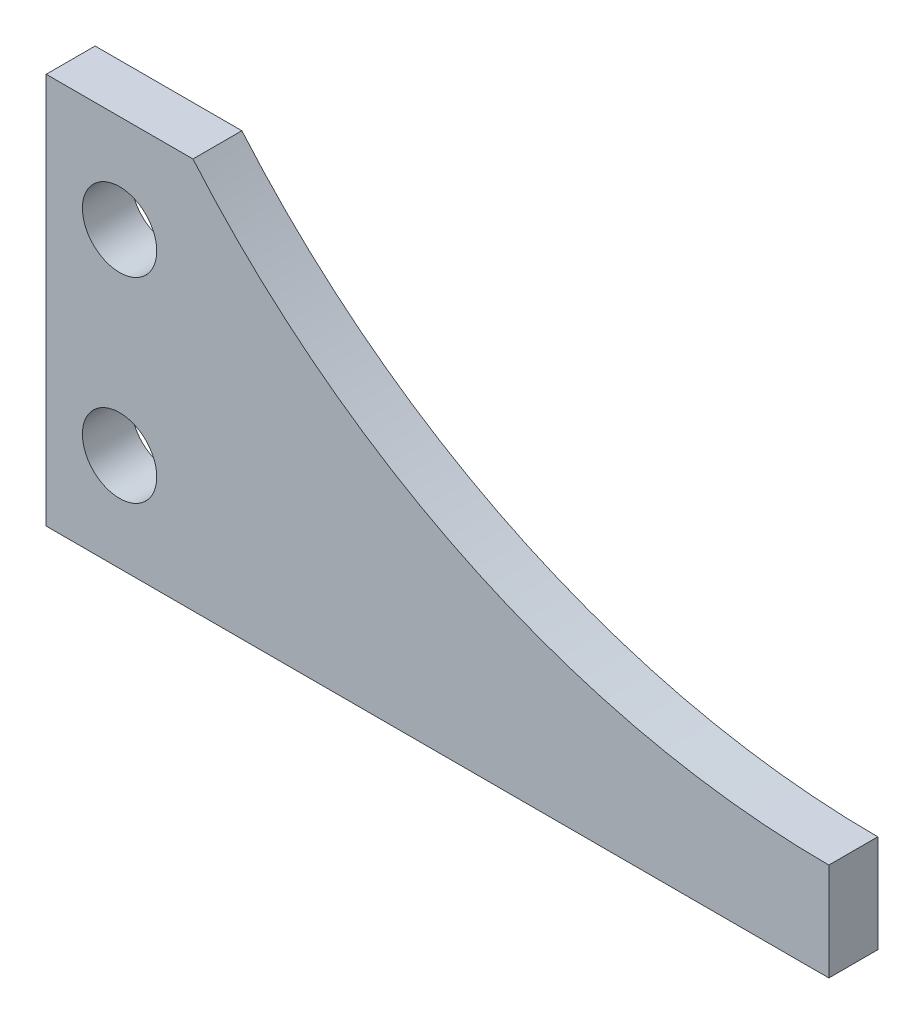
ISO-10303-21;
HEADER;
FILE_DESCRIPTION(('STEP AP214'),'2;1');
FILE_NAME('part.step','',(''),(''),'','','');
FILE_SCHEMA(('AUTOMOTIVE_DESIGN { 1 0 10303 214 1 1 1 1 }'));
ENDSEC;
DATA;
#1=APPLICATION_CONTEXT('core data for automotive mechanical design processes');
#2=APPLICATION_PROTOCOL_DEFINITION('international standard','automotive_design',2000,#1);
#3=PRODUCT_CONTEXT('',#1,'mechanical');
#4=PRODUCT('Part','Part','',(#3));
#5=PRODUCT_RELATED_PRODUCT_CATEGORY('part','',(#4));
#6=PRODUCT_DEFINITION_FORMATION('','',#4);
#7=PRODUCT_DEFINITION_CONTEXT('part definition',#1,'design');
#8=PRODUCT_DEFINITION('design','',#6,#7);
#9=PRODUCT_DEFINITION_SHAPE('','',#8);
#10=(LENGTH_UNIT() NAMED_UNIT(*) SI_UNIT(.MILLI.,.METRE.));
#11=(NAMED_UNIT(*) PLANE_ANGLE_UNIT() SI_UNIT($,.RADIAN.));
#12=(NAMED_UNIT(*) SI_UNIT($,.STERADIAN.) SOLID_ANGLE_UNIT());
#13=UNCERTAINTY_MEASURE_WITH_UNIT(LENGTH_MEASURE(1.E-05),#10,'distance_accuracy_value','');
#14=(GEOMETRIC_REPRESENTATION_CONTEXT(3) GLOBAL_UNCERTAINTY_ASSIGNED_CONTEXT((#13)) GLOBAL_UNIT_ASSIGNED_CONTEXT((#10,
#11,#12)) REPRESENTATION_CONTEXT('',''));
#15=CARTESIAN_POINT('',(0.,0.,0.));
#16=DIRECTION('',(0.,0.,1.));
#17=DIRECTION('',(1.,0.,0.));
#18=AXIS2_PLACEMENT_3D('',#15,#16,#17);
#19=CARTESIAN_POINT('',(50.8,60.5895833333333,3.175));
#20=DIRECTION('',(0.,0.,1.));
#21=DIRECTION('',(1.,0.,0.));
#22=AXIS2_PLACEMENT_3D('',#19,#20,#21);
#23=PLANE('',#22);
#24=CARTESIAN_POINT('',(4.7625,19.05,3.175));
#25=DIRECTION('',(0.,0.,1.));
#26=DIRECTION('',(1.,0.,0.));
#27=AXIS2_PLACEMENT_3D('',#24,#25,#26);
#28=CIRCLE('',#27,2.413);
#29=CARTESIAN_POINT('',(7.1755,19.05,3.175));
#30=VERTEX_POINT('',#29);
#31=EDGE_CURVE('E112',#30,#30,#28,.T.);
#32=ORIENTED_EDGE('',*,*,#31,.F.);
#33=EDGE_LOOP('',(#32));
#34=FACE_BOUND('',#33,.T.);
#35=DIRECTION('',(1.,0.,0.));
#36=VECTOR('',#35,1.);
#37=CARTESIAN_POINT('',(0.,0.,3.175));
#38=LINE('',#37,#36);
#39=CARTESIAN_POINT('',(0.,0.,3.175));
#40=VERTEX_POINT('',#39);
#41=CARTESIAN_POINT('',(50.8,0.,3.175));
#42=VERTEX_POINT('',#41);
#43=EDGE_CURVE('E117',#40,#42,#38,.T.);
#44=ORIENTED_EDGE('',*,*,#43,.T.);
#45=DIRECTION('',(0.,1.,0.));
#46=VECTOR('',#45,1.);
#47=CARTESIAN_POINT('',(50.8,0.,3.175));
#48=LINE('',#47,#46);
#49=CARTESIAN_POINT('',(50.8,6.35,3.175));
#50=VERTEX_POINT('',#49);
#51=EDGE_CURVE('E84',#42,#50,#48,.T.);
#52=ORIENTED_EDGE('',*,*,#51,.T.);
#53=CARTESIAN_POINT('',(50.8,60.5895833333333,3.175));
#54=DIRECTION('',(0.,0.,-1.));
#55=DIRECTION('',(1.,0.,0.));
#56=AXIS2_PLACEMENT_3D('',#53,#54,#55);
#57=CIRCLE('',#56,54.2395833333333);
#58=CARTESIAN_POINT('',(9.525,25.4,3.175));
#59=VERTEX_POINT('',#58);
#60=EDGE_CURVE('E88',#50,#59,#57,.T.);
#61=ORIENTED_EDGE('',*,*,#60,.T.);
#62=DIRECTION('',(-1.,0.,0.));
#63=VECTOR('',#62,1.);
#64=CARTESIAN_POINT('',(0.,25.4,3.175));
#65=LINE('',#64,#63);
#66=CARTESIAN_POINT('',(0.,25.4,3.175));
#67=VERTEX_POINT('',#66);
#68=EDGE_CURVE('E92',#59,#67,#65,.T.);
#69=ORIENTED_EDGE('',*,*,#68,.T.);
#70=DIRECTION('',(0.,-1.,0.));
#71=VECTOR('',#70,1.);
#72=CARTESIAN_POINT('',(0.,0.,3.175));
#73=LINE('',#72,#71);
#74=EDGE_CURVE('E50',#67,#40,#73,.T.);
#75=ORIENTED_EDGE('',*,*,#74,.T.);
#76=EDGE_LOOP('',(#44,#52,#61,#69,#75));
#77=FACE_BOUND('',#76,.T.);
#78=CARTESIAN_POINT('',(4.7625,6.35,3.175));
#79=DIRECTION('',(0.,0.,1.));
#80=DIRECTION('',(1.,0.,0.));
#81=AXIS2_PLACEMENT_3D('',#78,#79,#80);
#82=CIRCLE('',#81,2.413);
#83=CARTESIAN_POINT('',(7.1755,6.35,3.175));
#84=VERTEX_POINT('',#83);
#85=EDGE_CURVE('E154',#84,#84,#82,.T.);
#86=ORIENTED_EDGE('',*,*,#85,.F.);
#87=EDGE_LOOP('',(#86));
#88=FACE_BOUND('',#87,.T.);
#89=ADVANCED_FACE('F33',(#34,#77,#88),#23,.T.);
#90=CARTESIAN_POINT('',(50.8,60.5895833333333,0.));
#91=DIRECTION('',(0.,0.,1.));
#92=DIRECTION('',(1.,0.,0.));
#93=AXIS2_PLACEMENT_3D('',#90,#91,#92);
#94=PLANE('',#93);
#95=DIRECTION('',(1.,0.,0.));
#96=VECTOR('',#95,1.);
#97=CARTESIAN_POINT('',(0.,0.,0.));
#98=LINE('',#97,#96);
#99=CARTESIAN_POINT('',(0.,0.,0.));
#100=VERTEX_POINT('',#99);
#101=CARTESIAN_POINT('',(50.8,0.,0.));
#102=VERTEX_POINT('',#101);
#103=EDGE_CURVE('E108',#100,#102,#98,.T.);
#104=ORIENTED_EDGE('',*,*,#103,.F.);
#105=DIRECTION('',(0.,-1.,0.));
#106=VECTOR('',#105,1.);
#107=CARTESIAN_POINT('',(0.,0.,0.));
#108=LINE('',#107,#106);
#109=CARTESIAN_POINT('',(0.,25.4,0.));
#110=VERTEX_POINT('',#109);
#111=EDGE_CURVE('E76',#110,#100,#108,.T.);
#112=ORIENTED_EDGE('',*,*,#111,.F.);
#113=DIRECTION('',(-1.,0.,0.));
#114=VECTOR('',#113,1.);
#115=CARTESIAN_POINT('',(0.,25.4,0.));
#116=LINE('',#115,#114);
#117=CARTESIAN_POINT('',(9.525,25.4,0.));
#118=VERTEX_POINT('',#117);
#119=EDGE_CURVE('E70',#118,#110,#116,.T.);
#120=ORIENTED_EDGE('',*,*,#119,.F.);
#121=CARTESIAN_POINT('',(50.8,60.5895833333333,0.));
#122=DIRECTION('',(0.,0.,-1.));
#123=DIRECTION('',(1.,0.,0.));
#124=AXIS2_PLACEMENT_3D('',#121,#122,#123);
#125=CIRCLE('',#124,54.2395833333333);
#126=CARTESIAN_POINT('',(50.8,6.35,0.));
#127=VERTEX_POINT('',#126);
#128=EDGE_CURVE('E99',#127,#118,#125,.T.);
#129=ORIENTED_EDGE('',*,*,#128,.F.);
#130=DIRECTION('',(0.,1.,0.));
#131=VECTOR('',#130,1.);
#132=CARTESIAN_POINT('',(50.8,0.,0.));
#133=LINE('',#132,#131);
#134=EDGE_CURVE('E111',#102,#127,#133,.T.);
#135=ORIENTED_EDGE('',*,*,#134,.F.);
#136=EDGE_LOOP('',(#104,#112,#120,#129,#135));
#137=FACE_BOUND('',#136,.T.);
#138=CARTESIAN_POINT('',(4.7625,19.05,0.));
#139=DIRECTION('',(0.,0.,1.));
#140=DIRECTION('',(1.,0.,0.));
#141=AXIS2_PLACEMENT_3D('',#138,#139,#140);
#142=CIRCLE('',#141,2.413);
#143=CARTESIAN_POINT('',(7.1755,19.05,0.));
#144=VERTEX_POINT('',#143);
#145=EDGE_CURVE('E160',#144,#144,#142,.T.);
#146=ORIENTED_EDGE('',*,*,#145,.T.);
#147=EDGE_LOOP('',(#146));
#148=FACE_BOUND('',#147,.T.);
#149=CARTESIAN_POINT('',(4.7625,6.35,0.));
#150=DIRECTION('',(0.,0.,1.));
#151=DIRECTION('',(1.,0.,0.));
#152=AXIS2_PLACEMENT_3D('',#149,#150,#151);
#153=CIRCLE('',#152,2.413);
#154=CARTESIAN_POINT('',(7.1755,6.35,0.));
#155=VERTEX_POINT('',#154);
#156=EDGE_CURVE('E157',#155,#155,#153,.T.);
#157=ORIENTED_EDGE('',*,*,#156,.T.);
#158=EDGE_LOOP('',(#157));
#159=FACE_BOUND('',#158,.T.);
#160=ADVANCED_FACE('F121',(#137,#148,#159),#94,.F.);
#161=CARTESIAN_POINT('',(0.,0.,3.175));
#162=DIRECTION('',(0.,1.,0.));
#163=DIRECTION('',(0.,0.,1.));
#164=AXIS2_PLACEMENT_3D('',#161,#162,#163);
#165=PLANE('',#164);
#166=ORIENTED_EDGE('',*,*,#103,.T.);
#167=DIRECTION('',(0.,0.,-1.));
#168=VECTOR('',#167,1.);
#169=CARTESIAN_POINT('',(50.8,0.,3.175));
#170=LINE('',#169,#168);
#171=EDGE_CURVE('E11',#42,#102,#170,.T.);
#172=ORIENTED_EDGE('',*,*,#171,.F.);
#173=ORIENTED_EDGE('',*,*,#43,.F.);
#174=DIRECTION('',(0.,0.,-1.));
#175=VECTOR('',#174,1.);
#176=CARTESIAN_POINT('',(0.,0.,3.175));
#177=LINE('',#176,#175);
#178=EDGE_CURVE('E104',#40,#100,#177,.T.);
#179=ORIENTED_EDGE('',*,*,#178,.T.);
#180=EDGE_LOOP('',(#166,#172,#173,#179));
#181=FACE_BOUND('',#180,.T.);
#182=ADVANCED_FACE('F35',(#181),#165,.F.);
#183=CARTESIAN_POINT('',(50.8,0.,3.175));
#184=DIRECTION('',(-1.,0.,0.));
#185=DIRECTION('',(0.,-1.,0.));
#186=AXIS2_PLACEMENT_3D('',#183,#184,#185);
#187=PLANE('',#186);
#188=ORIENTED_EDGE('',*,*,#134,.T.);
#189=DIRECTION('',(0.,0.,-1.));
#190=VECTOR('',#189,1.);
#191=CARTESIAN_POINT('',(50.8,6.35,3.175));
#192=LINE('',#191,#190);
#193=EDGE_CURVE('E42',#50,#127,#192,.T.);
#194=ORIENTED_EDGE('',*,*,#193,.F.);
#195=ORIENTED_EDGE('',*,*,#51,.F.);
#196=ORIENTED_EDGE('',*,*,#171,.T.);
#197=EDGE_LOOP('',(#188,#194,#195,#196));
#198=FACE_BOUND('',#197,.T.);
#199=ADVANCED_FACE('F192',(#198),#187,.F.);
#200=CARTESIAN_POINT('',(50.8,60.5895833333333,3.175));
#201=DIRECTION('',(0.,0.,-1.));
#202=DIRECTION('',(-1.,0.,0.));
#203=AXIS2_PLACEMENT_3D('',#200,#201,#202);
#204=CYLINDRICAL_SURFACE('',#203,54.2395833333333);
#205=ORIENTED_EDGE('',*,*,#128,.T.);
#206=DIRECTION('',(0.,0.,-1.));
#207=VECTOR('',#206,1.);
#208=CARTESIAN_POINT('',(9.525,25.4,3.175));
#209=LINE('',#208,#207);
#210=EDGE_CURVE('E96',#59,#118,#209,.T.);
#211=ORIENTED_EDGE('',*,*,#210,.F.);
#212=ORIENTED_EDGE('',*,*,#60,.F.);
#213=ORIENTED_EDGE('',*,*,#193,.T.);
#214=EDGE_LOOP('',(#205,#211,#212,#213));
#215=FACE_BOUND('',#214,.T.);
#216=ADVANCED_FACE('F97',(#215),#204,.F.);
#217=CARTESIAN_POINT('',(0.,25.4,3.175));
#218=DIRECTION('',(0.,-1.,0.));
#219=DIRECTION('',(0.,0.,-1.));
#220=AXIS2_PLACEMENT_3D('',#217,#218,#219);
#221=PLANE('',#220);
#222=ORIENTED_EDGE('',*,*,#119,.T.);
#223=DIRECTION('',(0.,0.,-1.));
#224=VECTOR('',#223,1.);
#225=CARTESIAN_POINT('',(0.,25.4,3.175));
#226=LINE('',#225,#224);
#227=EDGE_CURVE('E100',#67,#110,#226,.T.);
#228=ORIENTED_EDGE('',*,*,#227,.F.);
#229=ORIENTED_EDGE('',*,*,#68,.F.);
#230=ORIENTED_EDGE('',*,*,#210,.T.);
#231=EDGE_LOOP('',(#222,#228,#229,#230));
#232=FACE_BOUND('',#231,.T.);
#233=ADVANCED_FACE('F102',(#232),#221,.F.);
#234=CARTESIAN_POINT('',(0.,0.,3.175));
#235=DIRECTION('',(1.,0.,0.));
#236=DIRECTION('',(0.,0.,-1.));
#237=AXIS2_PLACEMENT_3D('',#234,#235,#236);
#238=PLANE('',#237);
#239=ORIENTED_EDGE('',*,*,#111,.T.);
#240=ORIENTED_EDGE('',*,*,#178,.F.);
#241=ORIENTED_EDGE('',*,*,#74,.F.);
#242=ORIENTED_EDGE('',*,*,#227,.T.);
#243=EDGE_LOOP('',(#239,#240,#241,#242));
#244=FACE_BOUND('',#243,.T.);
#245=ADVANCED_FACE('F126',(#244),#238,.F.);
#246=CARTESIAN_POINT('',(4.7625,19.05,3.175));
#247=DIRECTION('',(0.,0.,-1.));
#248=DIRECTION('',(-1.,0.,0.));
#249=AXIS2_PLACEMENT_3D('',#246,#247,#248);
#250=CYLINDRICAL_SURFACE('',#249,2.413);
#251=ORIENTED_EDGE('',*,*,#31,.T.);
#252=EDGE_LOOP('',(#251));
#253=FACE_BOUND('',#252,.T.);
#254=ORIENTED_EDGE('',*,*,#145,.F.);
#255=EDGE_LOOP('',(#254));
#256=FACE_BOUND('',#255,.T.);
#257=ADVANCED_FACE('F128',(#253,#256),#250,.F.);
#258=CARTESIAN_POINT('',(4.7625,6.35,3.175));
#259=DIRECTION('',(0.,0.,-1.));
#260=DIRECTION('',(-1.,0.,0.));
#261=AXIS2_PLACEMENT_3D('',#258,#259,#260);
#262=CYLINDRICAL_SURFACE('',#261,2.413);
#263=ORIENTED_EDGE('',*,*,#85,.T.);
#264=EDGE_LOOP('',(#263));
#265=FACE_BOUND('',#264,.T.);
#266=ORIENTED_EDGE('',*,*,#156,.F.);
#267=EDGE_LOOP('',(#266));
#268=FACE_BOUND('',#267,.T.);
#269=ADVANCED_FACE('F134',(#265,#268),#262,.F.);
#270=CLOSED_SHELL('',(#89,#160,#182,#199,#216,#233,#245,#257,#269));
#271=MANIFOLD_SOLID_BREP('B2',#270);
#272=ADVANCED_BREP_SHAPE_REPRESENTATION('',(#18,#271),#14);
#273=SHAPE_DEFINITION_REPRESENTATION(#9,#272);
ENDSEC;
END-ISO-10303-21;
